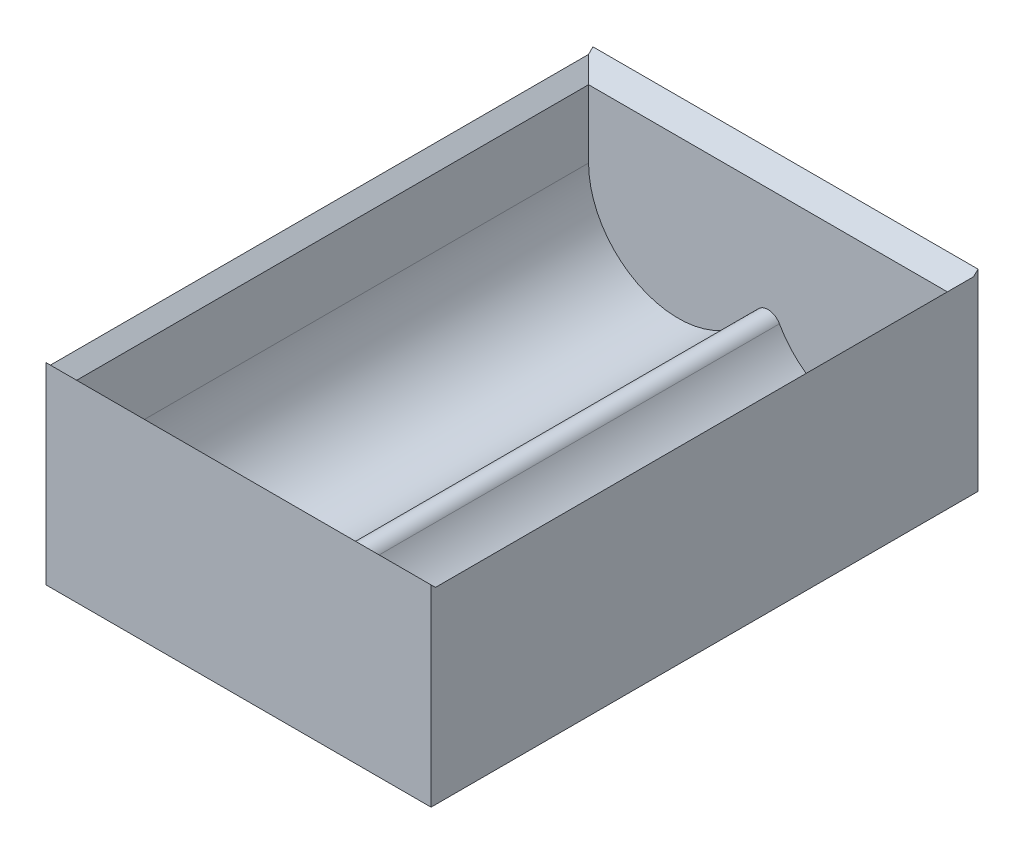
ISO-10303-21;
HEADER;
FILE_DESCRIPTION(('STEP AP214'),'2;1');
FILE_NAME('part.step','',(''),(''),'','','');
FILE_SCHEMA(('AUTOMOTIVE_DESIGN { 1 0 10303 214 1 1 1 1 }'));
ENDSEC;
DATA;
#1=APPLICATION_CONTEXT('core data for automotive mechanical design processes');
#2=APPLICATION_PROTOCOL_DEFINITION('international standard','automotive_design',2000,#1);
#3=PRODUCT_CONTEXT('',#1,'mechanical');
#4=PRODUCT('Part','Part','',(#3));
#5=PRODUCT_RELATED_PRODUCT_CATEGORY('part','',(#4));
#6=PRODUCT_DEFINITION_FORMATION('','',#4);
#7=PRODUCT_DEFINITION_CONTEXT('part definition',#1,'design');
#8=PRODUCT_DEFINITION('design','',#6,#7);
#9=PRODUCT_DEFINITION_SHAPE('','',#8);
#10=(LENGTH_UNIT() NAMED_UNIT(*) SI_UNIT(.MILLI.,.METRE.));
#11=(NAMED_UNIT(*) PLANE_ANGLE_UNIT() SI_UNIT($,.RADIAN.));
#12=(NAMED_UNIT(*) SI_UNIT($,.STERADIAN.) SOLID_ANGLE_UNIT());
#13=UNCERTAINTY_MEASURE_WITH_UNIT(LENGTH_MEASURE(1.E-05),#10,'distance_accuracy_value','');
#14=(GEOMETRIC_REPRESENTATION_CONTEXT(3) GLOBAL_UNCERTAINTY_ASSIGNED_CONTEXT((#13)) GLOBAL_UNIT_ASSIGNED_CONTEXT((#10,
#11,#12)) REPRESENTATION_CONTEXT('',''));
#15=CARTESIAN_POINT('',(0.,0.,0.));
#16=DIRECTION('',(0.,0.,1.));
#17=DIRECTION('',(1.,0.,0.));
#18=AXIS2_PLACEMENT_3D('',#15,#16,#17);
#19=CARTESIAN_POINT('',(44.,50.,-62.5));
#20=DIRECTION('',(-1.,0.,0.));
#21=DIRECTION('',(0.,0.,1.));
#22=AXIS2_PLACEMENT_3D('',#19,#20,#21);
#23=PLANE('',#22);
#24=DIRECTION('',(0.,0.,1.));
#25=VECTOR('',#24,1.);
#26=CARTESIAN_POINT('',(44.,42.9999999999999,-165.603103736018));
#27=LINE('',#26,#25);
#28=CARTESIAN_POINT('',(44.,42.9999999999999,-61.5));
#29=VERTEX_POINT('',#28);
#30=CARTESIAN_POINT('',(44.,42.9999999999999,61.5));
#31=VERTEX_POINT('',#30);
#32=EDGE_CURVE('E228',#29,#31,#27,.T.);
#33=ORIENTED_EDGE('',*,*,#32,.T.);
#34=DIRECTION('',(0.,0.707106781186544,0.707106781186551));
#35=VECTOR('',#34,1.);
#36=CARTESIAN_POINT('',(44.,39.9999999999999,58.5));
#37=LINE('',#36,#35);
#38=CARTESIAN_POINT('',(44.,43.9999999999999,62.5));
#39=VERTEX_POINT('',#38);
#40=EDGE_CURVE('E231',#31,#39,#37,.T.);
#41=ORIENTED_EDGE('',*,*,#40,.T.);
#42=DIRECTION('',(0.,-1.,0.));
#43=VECTOR('',#42,1.);
#44=CARTESIAN_POINT('',(44.,50.,62.5));
#45=LINE('',#44,#43);
#46=CARTESIAN_POINT('',(44.,0.,62.5));
#47=VERTEX_POINT('',#46);
#48=EDGE_CURVE('E200',#39,#47,#45,.T.);
#49=ORIENTED_EDGE('',*,*,#48,.T.);
#50=DIRECTION('',(0.,0.,-1.));
#51=VECTOR('',#50,1.);
#52=CARTESIAN_POINT('',(44.,0.,-62.5));
#53=LINE('',#52,#51);
#54=CARTESIAN_POINT('',(44.,0.,-62.5));
#55=VERTEX_POINT('',#54);
#56=EDGE_CURVE('E183',#47,#55,#53,.T.);
#57=ORIENTED_EDGE('',*,*,#56,.T.);
#58=DIRECTION('',(0.,-1.,0.));
#59=VECTOR('',#58,1.);
#60=CARTESIAN_POINT('',(44.,50.,-62.5));
#61=LINE('',#60,#59);
#62=CARTESIAN_POINT('',(44.,43.9999999999999,-62.5));
#63=VERTEX_POINT('',#62);
#64=EDGE_CURVE('E209',#63,#55,#61,.T.);
#65=ORIENTED_EDGE('',*,*,#64,.F.);
#66=DIRECTION('',(0.,0.707106781186544,-0.707106781186551));
#67=VECTOR('',#66,1.);
#68=CARTESIAN_POINT('',(44.,50.,-68.5000000000002));
#69=LINE('',#68,#67);
#70=EDGE_CURVE('E225',#63,#29,#69,.F.);
#71=ORIENTED_EDGE('',*,*,#70,.T.);
#72=EDGE_LOOP('',(#33,#41,#49,#57,#65,#71));
#73=FACE_BOUND('',#72,.T.);
#74=ADVANCED_FACE('F51',(#73),#23,.F.);
#75=CARTESIAN_POINT('',(-44.,50.,-62.5));
#76=DIRECTION('',(0.,0.,1.));
#77=DIRECTION('',(1.,0.,0.));
#78=AXIS2_PLACEMENT_3D('',#75,#76,#77);
#79=PLANE('',#78);
#80=DIRECTION('',(0.,-1.,0.));
#81=VECTOR('',#80,1.);
#82=CARTESIAN_POINT('',(-44.,50.,-62.5));
#83=LINE('',#82,#81);
#84=CARTESIAN_POINT('',(-44.,43.9999999999999,-62.5));
#85=VERTEX_POINT('',#84);
#86=CARTESIAN_POINT('',(-44.,0.,-62.5));
#87=VERTEX_POINT('',#86);
#88=EDGE_CURVE('E206',#85,#87,#83,.T.);
#89=ORIENTED_EDGE('',*,*,#88,.F.);
#90=DIRECTION('',(-1.,0.,0.));
#91=VECTOR('',#90,1.);
#92=CARTESIAN_POINT('',(0.,43.9999999999999,-62.5));
#93=LINE('',#92,#91);
#94=EDGE_CURVE('E62',#85,#63,#93,.F.);
#95=ORIENTED_EDGE('',*,*,#94,.T.);
#96=ORIENTED_EDGE('',*,*,#64,.T.);
#97=DIRECTION('',(-1.,0.,0.));
#98=VECTOR('',#97,1.);
#99=CARTESIAN_POINT('',(-44.,0.,-62.5));
#100=LINE('',#99,#98);
#101=EDGE_CURVE('E188',#55,#87,#100,.T.);
#102=ORIENTED_EDGE('',*,*,#101,.T.);
#103=EDGE_LOOP('',(#89,#95,#96,#102));
#104=FACE_BOUND('',#103,.T.);
#105=ADVANCED_FACE('F283',(#104),#79,.F.);
#106=CARTESIAN_POINT('',(-44.,50.,-62.5));
#107=DIRECTION('',(1.,0.,0.));
#108=DIRECTION('',(0.,0.,-1.));
#109=AXIS2_PLACEMENT_3D('',#106,#107,#108);
#110=PLANE('',#109);
#111=DIRECTION('',(0.,-1.,0.));
#112=VECTOR('',#111,1.);
#113=CARTESIAN_POINT('',(-44.,50.,62.5));
#114=LINE('',#113,#112);
#115=CARTESIAN_POINT('',(-44.,43.9999999999999,62.5));
#116=VERTEX_POINT('',#115);
#117=CARTESIAN_POINT('',(-44.,0.,62.5));
#118=VERTEX_POINT('',#117);
#119=EDGE_CURVE('E203',#116,#118,#114,.T.);
#120=ORIENTED_EDGE('',*,*,#119,.F.);
#121=DIRECTION('',(0.,-0.707106781186544,-0.707106781186551));
#122=VECTOR('',#121,1.);
#123=CARTESIAN_POINT('',(-44.,39.9999999999999,58.5));
#124=LINE('',#123,#122);
#125=CARTESIAN_POINT('',(-44.,42.9999999999999,61.5));
#126=VERTEX_POINT('',#125);
#127=EDGE_CURVE('E244',#116,#126,#124,.T.);
#128=ORIENTED_EDGE('',*,*,#127,.T.);
#129=DIRECTION('',(0.,0.,1.));
#130=VECTOR('',#129,1.);
#131=CARTESIAN_POINT('',(-44.,42.9999999999999,0.));
#132=LINE('',#131,#130);
#133=CARTESIAN_POINT('',(-44.,42.9999999999999,-61.5));
#134=VERTEX_POINT('',#133);
#135=EDGE_CURVE('E241',#126,#134,#132,.F.);
#136=ORIENTED_EDGE('',*,*,#135,.T.);
#137=DIRECTION('',(0.,-0.707106781186544,0.707106781186551));
#138=VECTOR('',#137,1.);
#139=CARTESIAN_POINT('',(-44.,50.,-68.5000000000002));
#140=LINE('',#139,#138);
#141=EDGE_CURVE('E238',#134,#85,#140,.F.);
#142=ORIENTED_EDGE('',*,*,#141,.T.);
#143=ORIENTED_EDGE('',*,*,#88,.T.);
#144=DIRECTION('',(0.,0.,1.));
#145=VECTOR('',#144,1.);
#146=CARTESIAN_POINT('',(-44.,0.,-62.5));
#147=LINE('',#146,#145);
#148=EDGE_CURVE('E192',#87,#118,#147,.T.);
#149=ORIENTED_EDGE('',*,*,#148,.T.);
#150=EDGE_LOOP('',(#120,#128,#136,#142,#143,#149));
#151=FACE_BOUND('',#150,.T.);
#152=ADVANCED_FACE('F281',(#151),#110,.F.);
#153=CARTESIAN_POINT('',(-44.,50.,62.5));
#154=DIRECTION('',(0.,0.,-1.));
#155=DIRECTION('',(-1.,0.,0.));
#156=AXIS2_PLACEMENT_3D('',#153,#154,#155);
#157=PLANE('',#156);
#158=ORIENTED_EDGE('',*,*,#48,.F.);
#159=DIRECTION('',(-1.,0.,0.));
#160=VECTOR('',#159,1.);
#161=CARTESIAN_POINT('',(0.,43.9999999999999,62.5));
#162=LINE('',#161,#160);
#163=EDGE_CURVE('E235',#39,#116,#162,.T.);
#164=ORIENTED_EDGE('',*,*,#163,.T.);
#165=ORIENTED_EDGE('',*,*,#119,.T.);
#166=DIRECTION('',(1.,0.,0.));
#167=VECTOR('',#166,1.);
#168=CARTESIAN_POINT('',(-44.,0.,62.5));
#169=LINE('',#168,#167);
#170=EDGE_CURVE('E196',#118,#47,#169,.T.);
#171=ORIENTED_EDGE('',*,*,#170,.T.);
#172=EDGE_LOOP('',(#158,#164,#165,#171));
#173=FACE_BOUND('',#172,.T.);
#174=ADVANCED_FACE('F365',(#173),#157,.F.);
#175=CARTESIAN_POINT('',(0.,0.,0.));
#176=DIRECTION('',(0.,1.,0.));
#177=DIRECTION('',(0.,0.,1.));
#178=AXIS2_PLACEMENT_3D('',#175,#176,#177);
#179=PLANE('',#178);
#180=ORIENTED_EDGE('',*,*,#56,.F.);
#181=ORIENTED_EDGE('',*,*,#170,.F.);
#182=ORIENTED_EDGE('',*,*,#148,.F.);
#183=ORIENTED_EDGE('',*,*,#101,.F.);
#184=EDGE_LOOP('',(#180,#181,#182,#183));
#185=FACE_BOUND('',#184,.T.);
#186=ADVANCED_FACE('F290',(#185),#179,.F.);
#187=CARTESIAN_POINT('',(20.5,24.5,-165.603103736018));
#188=DIRECTION('',(0.,0.,1.));
#189=DIRECTION('',(1.,0.,0.));
#190=AXIS2_PLACEMENT_3D('',#187,#188,#189);
#191=CYLINDRICAL_SURFACE('',#190,20.5);
#192=CARTESIAN_POINT('',(20.5,24.5,-58.5));
#193=DIRECTION('',(0.,0.,1.));
#194=DIRECTION('',(1.,0.,0.));
#195=AXIS2_PLACEMENT_3D('',#192,#193,#194);
#196=CIRCLE('',#195,20.5);
#197=CARTESIAN_POINT('',(2.61702127659574,14.4775715528485,-58.5));
#198=VERTEX_POINT('',#197);
#199=CARTESIAN_POINT('',(41.,24.5,-58.5));
#200=VERTEX_POINT('',#199);
#201=EDGE_CURVE('E184',#198,#200,#196,.T.);
#202=ORIENTED_EDGE('',*,*,#201,.F.);
#203=DIRECTION('',(0.,0.,1.));
#204=VECTOR('',#203,1.);
#205=CARTESIAN_POINT('',(2.61702127659574,14.4775715528485,-165.603103736018));
#206=LINE('',#205,#204);
#207=CARTESIAN_POINT('',(2.61702127659574,14.4775715528485,58.5));
#208=VERTEX_POINT('',#207);
#209=EDGE_CURVE('E159',#198,#208,#206,.T.);
#210=ORIENTED_EDGE('',*,*,#209,.T.);
#211=CARTESIAN_POINT('',(20.5,24.5,58.5));
#212=DIRECTION('',(0.,0.,1.));
#213=DIRECTION('',(1.,0.,0.));
#214=AXIS2_PLACEMENT_3D('',#211,#212,#213);
#215=CIRCLE('',#214,20.5);
#216=CARTESIAN_POINT('',(41.,24.5,58.5));
#217=VERTEX_POINT('',#216);
#218=EDGE_CURVE('E156',#217,#208,#215,.F.);
#219=ORIENTED_EDGE('',*,*,#218,.F.);
#220=DIRECTION('',(0.,0.,1.));
#221=VECTOR('',#220,1.);
#222=CARTESIAN_POINT('',(41.,24.5,-165.603103736018));
#223=LINE('',#222,#221);
#224=EDGE_CURVE('E141',#200,#217,#223,.T.);
#225=ORIENTED_EDGE('',*,*,#224,.F.);
#226=EDGE_LOOP('',(#202,#210,#219,#225));
#227=FACE_BOUND('',#226,.T.);
#228=ADVANCED_FACE('F157',(#227),#191,.F.);
#229=CARTESIAN_POINT('',(-20.5,24.5,-165.603103736018));
#230=DIRECTION('',(0.,0.,1.));
#231=DIRECTION('',(1.,0.,0.));
#232=AXIS2_PLACEMENT_3D('',#229,#230,#231);
#233=CYLINDRICAL_SURFACE('',#232,20.5);
#234=CARTESIAN_POINT('',(-20.5,24.5,58.5));
#235=DIRECTION('',(0.,0.,1.));
#236=DIRECTION('',(1.,0.,0.));
#237=AXIS2_PLACEMENT_3D('',#234,#235,#236);
#238=CIRCLE('',#237,20.5);
#239=CARTESIAN_POINT('',(-41.,24.5,58.5));
#240=VERTEX_POINT('',#239);
#241=CARTESIAN_POINT('',(-2.61702127659574,14.4775715528485,58.5));
#242=VERTEX_POINT('',#241);
#243=EDGE_CURVE('E152',#240,#242,#238,.T.);
#244=ORIENTED_EDGE('',*,*,#243,.T.);
#245=DIRECTION('',(0.,0.,1.));
#246=VECTOR('',#245,1.);
#247=CARTESIAN_POINT('',(-2.61702127659574,14.4775715528485,-165.603103736018));
#248=LINE('',#247,#246);
#249=CARTESIAN_POINT('',(-2.61702127659574,14.4775715528485,-58.5));
#250=VERTEX_POINT('',#249);
#251=EDGE_CURVE('E214',#242,#250,#248,.F.);
#252=ORIENTED_EDGE('',*,*,#251,.T.);
#253=CARTESIAN_POINT('',(-20.5,24.5,-58.5));
#254=DIRECTION('',(0.,0.,1.));
#255=DIRECTION('',(1.,0.,0.));
#256=AXIS2_PLACEMENT_3D('',#253,#254,#255);
#257=CIRCLE('',#256,20.5);
#258=CARTESIAN_POINT('',(-41.,24.5,-58.5));
#259=VERTEX_POINT('',#258);
#260=EDGE_CURVE('E339',#250,#259,#257,.F.);
#261=ORIENTED_EDGE('',*,*,#260,.T.);
#262=DIRECTION('',(0.,0.,1.));
#263=VECTOR('',#262,1.);
#264=CARTESIAN_POINT('',(-41.,24.5,-165.603103736018));
#265=LINE('',#264,#263);
#266=EDGE_CURVE('E151',#259,#240,#265,.T.);
#267=ORIENTED_EDGE('',*,*,#266,.T.);
#268=EDGE_LOOP('',(#244,#252,#261,#267));
#269=FACE_BOUND('',#268,.T.);
#270=ADVANCED_FACE('F348',(#269),#233,.F.);
#271=CARTESIAN_POINT('',(-41.,0.,-165.603103736018));
#272=DIRECTION('',(1.,0.,0.));
#273=DIRECTION('',(0.,0.,-1.));
#274=AXIS2_PLACEMENT_3D('',#271,#272,#273);
#275=PLANE('',#274);
#276=DIRECTION('',(0.,-1.,0.));
#277=VECTOR('',#276,1.);
#278=CARTESIAN_POINT('',(-41.,0.,-58.5));
#279=LINE('',#278,#277);
#280=CARTESIAN_POINT('',(-41.,39.9999999999999,-58.5));
#281=VERTEX_POINT('',#280);
#282=EDGE_CURVE('E179',#281,#259,#279,.T.);
#283=ORIENTED_EDGE('',*,*,#282,.F.);
#284=DIRECTION('',(0.,0.,1.));
#285=VECTOR('',#284,1.);
#286=CARTESIAN_POINT('',(-41.,39.9999999999999,-165.603103736018));
#287=LINE('',#286,#285);
#288=CARTESIAN_POINT('',(-41.,39.9999999999999,58.5));
#289=VERTEX_POINT('',#288);
#290=EDGE_CURVE('E249',#281,#289,#287,.T.);
#291=ORIENTED_EDGE('',*,*,#290,.T.);
#292=DIRECTION('',(0.,1.,0.));
#293=VECTOR('',#292,1.);
#294=CARTESIAN_POINT('',(-41.,0.,58.5));
#295=LINE('',#294,#293);
#296=EDGE_CURVE('E169',#240,#289,#295,.T.);
#297=ORIENTED_EDGE('',*,*,#296,.F.);
#298=ORIENTED_EDGE('',*,*,#266,.F.);
#299=EDGE_LOOP('',(#283,#291,#297,#298));
#300=FACE_BOUND('',#299,.T.);
#301=ADVANCED_FACE('F350',(#300),#275,.T.);
#302=CARTESIAN_POINT('',(41.,0.,-165.603103736018));
#303=DIRECTION('',(1.,0.,0.));
#304=DIRECTION('',(0.,0.,-1.));
#305=AXIS2_PLACEMENT_3D('',#302,#303,#304);
#306=PLANE('',#305);
#307=DIRECTION('',(0.,1.,0.));
#308=VECTOR('',#307,1.);
#309=CARTESIAN_POINT('',(41.,0.,58.5));
#310=LINE('',#309,#308);
#311=CARTESIAN_POINT('',(41.,39.9999999999999,58.5));
#312=VERTEX_POINT('',#311);
#313=EDGE_CURVE('E145',#217,#312,#310,.T.);
#314=ORIENTED_EDGE('',*,*,#313,.T.);
#315=DIRECTION('',(0.,0.,-1.));
#316=VECTOR('',#315,1.);
#317=CARTESIAN_POINT('',(41.,39.9999999999999,-58.5));
#318=LINE('',#317,#316);
#319=CARTESIAN_POINT('',(41.,39.9999999999999,-58.5));
#320=VERTEX_POINT('',#319);
#321=EDGE_CURVE('E76',#312,#320,#318,.T.);
#322=ORIENTED_EDGE('',*,*,#321,.T.);
#323=DIRECTION('',(0.,-1.,0.));
#324=VECTOR('',#323,1.);
#325=CARTESIAN_POINT('',(41.,0.,-58.5));
#326=LINE('',#325,#324);
#327=EDGE_CURVE('E146',#320,#200,#326,.T.);
#328=ORIENTED_EDGE('',*,*,#327,.T.);
#329=ORIENTED_EDGE('',*,*,#224,.T.);
#330=EDGE_LOOP('',(#314,#322,#328,#329));
#331=FACE_BOUND('',#330,.T.);
#332=ADVANCED_FACE('F143',(#331),#306,.F.);
#333=CARTESIAN_POINT('',(0.,0.,58.5));
#334=DIRECTION('',(0.,0.,1.));
#335=DIRECTION('',(1.,0.,0.));
#336=AXIS2_PLACEMENT_3D('',#333,#334,#335);
#337=PLANE('',#336);
#338=ORIENTED_EDGE('',*,*,#296,.T.);
#339=DIRECTION('',(1.,0.,0.));
#340=VECTOR('',#339,1.);
#341=CARTESIAN_POINT('',(41.,39.9999999999999,58.5));
#342=LINE('',#341,#340);
#343=EDGE_CURVE('E167',#289,#312,#342,.T.);
#344=ORIENTED_EDGE('',*,*,#343,.T.);
#345=ORIENTED_EDGE('',*,*,#313,.F.);
#346=ORIENTED_EDGE('',*,*,#218,.T.);
#347=CARTESIAN_POINT('',(0.,13.0108747069239,58.5));
#348=DIRECTION('',(0.,0.,1.));
#349=DIRECTION('',(1.,0.,0.));
#350=AXIS2_PLACEMENT_3D('',#347,#348,#349);
#351=CIRCLE('',#350,3.);
#352=EDGE_CURVE('E217',#208,#242,#351,.T.);
#353=ORIENTED_EDGE('',*,*,#352,.T.);
#354=ORIENTED_EDGE('',*,*,#243,.F.);
#355=EDGE_LOOP('',(#338,#344,#345,#346,#353,#354));
#356=FACE_BOUND('',#355,.T.);
#357=ADVANCED_FACE('F165',(#356),#337,.F.);
#358=CARTESIAN_POINT('',(-44.,50.,-58.5));
#359=DIRECTION('',(0.,0.,1.));
#360=DIRECTION('',(1.,0.,0.));
#361=AXIS2_PLACEMENT_3D('',#358,#359,#360);
#362=PLANE('',#361);
#363=ORIENTED_EDGE('',*,*,#327,.F.);
#364=DIRECTION('',(-1.,0.,0.));
#365=VECTOR('',#364,1.);
#366=CARTESIAN_POINT('',(-44.,39.9999999999999,-58.5));
#367=LINE('',#366,#365);
#368=EDGE_CURVE('E12',#320,#281,#367,.T.);
#369=ORIENTED_EDGE('',*,*,#368,.T.);
#370=ORIENTED_EDGE('',*,*,#282,.T.);
#371=ORIENTED_EDGE('',*,*,#260,.F.);
#372=CARTESIAN_POINT('',(0.,13.0108747069239,-58.5));
#373=DIRECTION('',(0.,0.,1.));
#374=DIRECTION('',(1.,0.,0.));
#375=AXIS2_PLACEMENT_3D('',#372,#373,#374);
#376=CIRCLE('',#375,3.);
#377=EDGE_CURVE('E220',#250,#198,#376,.F.);
#378=ORIENTED_EDGE('',*,*,#377,.T.);
#379=ORIENTED_EDGE('',*,*,#201,.T.);
#380=EDGE_LOOP('',(#363,#369,#370,#371,#378,#379));
#381=FACE_BOUND('',#380,.T.);
#382=ADVANCED_FACE('F317',(#381),#362,.T.);
#383=CARTESIAN_POINT('',(0.,13.0108747069239,-165.603103736018));
#384=DIRECTION('',(0.,0.,1.));
#385=DIRECTION('',(1.,0.,0.));
#386=AXIS2_PLACEMENT_3D('',#383,#384,#385);
#387=CYLINDRICAL_SURFACE('',#386,3.);
#388=ORIENTED_EDGE('',*,*,#377,.F.);
#389=ORIENTED_EDGE('',*,*,#251,.F.);
#390=ORIENTED_EDGE('',*,*,#352,.F.);
#391=ORIENTED_EDGE('',*,*,#209,.F.);
#392=EDGE_LOOP('',(#388,#389,#390,#391));
#393=FACE_BOUND('',#392,.T.);
#394=ADVANCED_FACE('F315',(#393),#387,.T.);
#395=CARTESIAN_POINT('',(0.,50.,-68.5000000000002));
#396=DIRECTION('',(0.,-0.707106781186551,-0.707106781186544));
#397=DIRECTION('',(1.,0.,0.));
#398=AXIS2_PLACEMENT_3D('',#395,#396,#397);
#399=PLANE('',#398);
#400=ORIENTED_EDGE('',*,*,#94,.F.);
#401=ORIENTED_EDGE('',*,*,#141,.F.);
#402=DIRECTION('',(-0.577350269189628,0.577350269189622,-0.577350269189628));
#403=VECTOR('',#402,1.);
#404=CARTESIAN_POINT('',(-34.,33.,-51.5));
#405=LINE('',#404,#403);
#406=EDGE_CURVE('E56',#281,#134,#405,.T.);
#407=ORIENTED_EDGE('',*,*,#406,.F.);
#408=ORIENTED_EDGE('',*,*,#368,.F.);
#409=DIRECTION('',(0.577350269189628,0.577350269189622,-0.577350269189628));
#410=VECTOR('',#409,1.);
#411=CARTESIAN_POINT('',(34.,33.,-51.5));
#412=LINE('',#411,#410);
#413=EDGE_CURVE('E260',#29,#320,#412,.F.);
#414=ORIENTED_EDGE('',*,*,#413,.F.);
#415=ORIENTED_EDGE('',*,*,#70,.F.);
#416=EDGE_LOOP('',(#400,#401,#407,#408,#414,#415));
#417=FACE_BOUND('',#416,.T.);
#418=ADVANCED_FACE('F54',(#417),#399,.F.);
#419=CARTESIAN_POINT('',(-51.0000000000002,50.,0.));
#420=DIRECTION('',(-0.707106781186544,-0.707106781186551,0.));
#421=DIRECTION('',(0.,0.,-1.));
#422=AXIS2_PLACEMENT_3D('',#419,#420,#421);
#423=PLANE('',#422);
#424=ORIENTED_EDGE('',*,*,#406,.T.);
#425=ORIENTED_EDGE('',*,*,#135,.F.);
#426=DIRECTION('',(0.577350269189628,-0.577350269189622,-0.577350269189628));
#427=VECTOR('',#426,1.);
#428=CARTESIAN_POINT('',(-28.1666666666666,27.1666666666667,45.6666666666666));
#429=LINE('',#428,#427);
#430=EDGE_CURVE('E257',#289,#126,#429,.F.);
#431=ORIENTED_EDGE('',*,*,#430,.F.);
#432=ORIENTED_EDGE('',*,*,#290,.F.);
#433=EDGE_LOOP('',(#424,#425,#431,#432));
#434=FACE_BOUND('',#433,.T.);
#435=ADVANCED_FACE('F272',(#434),#423,.F.);
#436=CARTESIAN_POINT('',(41.,39.9999999999999,-165.603103736018));
#437=DIRECTION('',(-0.707106781186544,0.707106781186551,0.));
#438=DIRECTION('',(0.,0.,1.));
#439=AXIS2_PLACEMENT_3D('',#436,#437,#438);
#440=PLANE('',#439);
#441=ORIENTED_EDGE('',*,*,#413,.T.);
#442=ORIENTED_EDGE('',*,*,#321,.F.);
#443=DIRECTION('',(-0.577350269189628,-0.577350269189622,-0.577350269189628));
#444=VECTOR('',#443,1.);
#445=CARTESIAN_POINT('',(-33.701034578673,-34.7010345786723,-16.2010345786731));
#446=LINE('',#445,#444);
#447=EDGE_CURVE('E254',#31,#312,#446,.T.);
#448=ORIENTED_EDGE('',*,*,#447,.F.);
#449=ORIENTED_EDGE('',*,*,#32,.F.);
#450=EDGE_LOOP('',(#441,#442,#448,#449));
#451=FACE_BOUND('',#450,.T.);
#452=ADVANCED_FACE('F297',(#451),#440,.T.);
#453=CARTESIAN_POINT('',(0.,39.9999999999999,58.5));
#454=DIRECTION('',(0.,0.707106781186551,-0.707106781186544));
#455=DIRECTION('',(-1.,0.,0.));
#456=AXIS2_PLACEMENT_3D('',#453,#454,#455);
#457=PLANE('',#456);
#458=ORIENTED_EDGE('',*,*,#127,.F.);
#459=ORIENTED_EDGE('',*,*,#163,.F.);
#460=ORIENTED_EDGE('',*,*,#40,.F.);
#461=ORIENTED_EDGE('',*,*,#447,.T.);
#462=ORIENTED_EDGE('',*,*,#343,.F.);
#463=ORIENTED_EDGE('',*,*,#430,.T.);
#464=EDGE_LOOP('',(#458,#459,#460,#461,#462,#463));
#465=FACE_BOUND('',#464,.T.);
#466=ADVANCED_FACE('F294',(#465),#457,.T.);
#467=CLOSED_SHELL('',(#74,#105,#152,#174,#186,#228,#270,#301,#332,#357,#382,#394,#418,#435,#452,#466));
#468=MANIFOLD_SOLID_BREP('B2',#467);
#469=ADVANCED_BREP_SHAPE_REPRESENTATION('',(#18,#468),#14);
#470=SHAPE_DEFINITION_REPRESENTATION(#9,#469);
ENDSEC;
END-ISO-10303-21;
